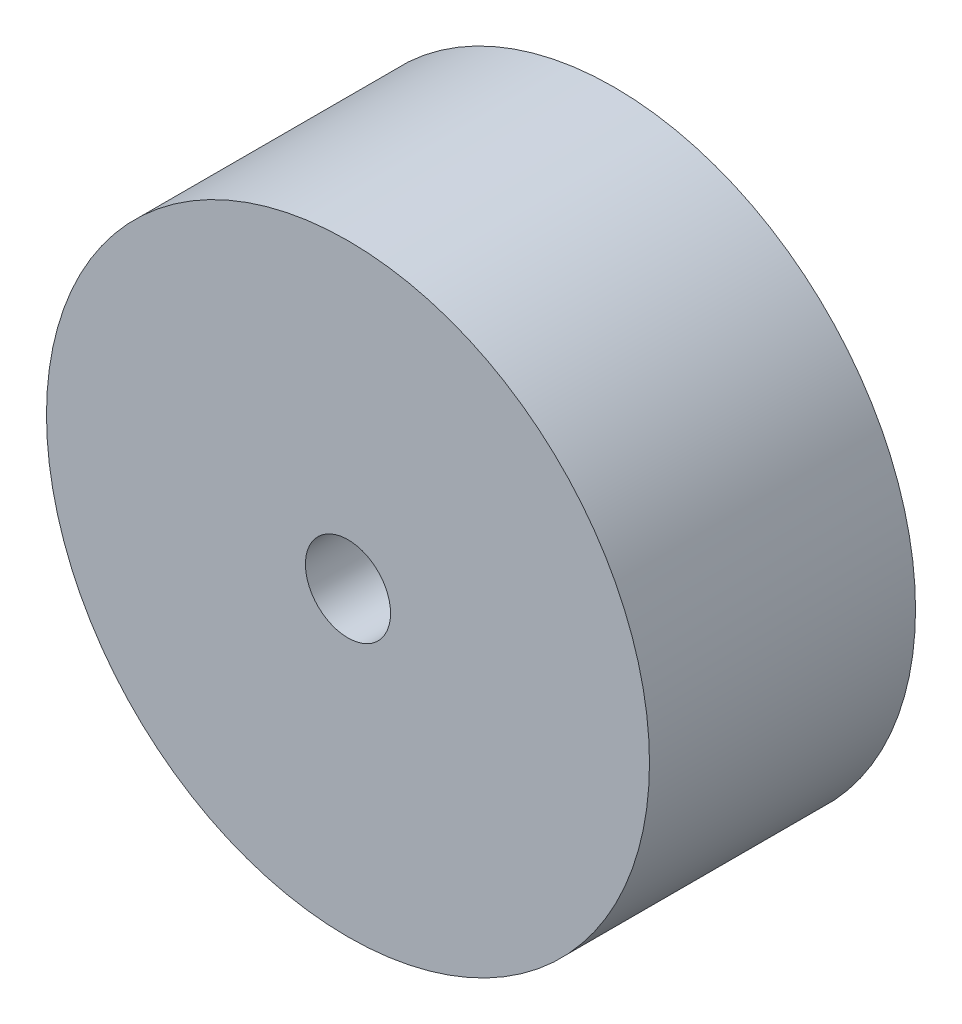
ISO-10303-21;
HEADER;
FILE_DESCRIPTION(('STEP AP214'),'2;1');
FILE_NAME('part.step','',(''),(''),'','','');
FILE_SCHEMA(('AUTOMOTIVE_DESIGN { 1 0 10303 214 1 1 1 1 }'));
ENDSEC;
DATA;
#1=APPLICATION_CONTEXT('core data for automotive mechanical design processes');
#2=APPLICATION_PROTOCOL_DEFINITION('international standard','automotive_design',2000,#1);
#3=PRODUCT_CONTEXT('',#1,'mechanical');
#4=PRODUCT('Part','Part','',(#3));
#5=PRODUCT_RELATED_PRODUCT_CATEGORY('part','',(#4));
#6=PRODUCT_DEFINITION_FORMATION('','',#4);
#7=PRODUCT_DEFINITION_CONTEXT('part definition',#1,'design');
#8=PRODUCT_DEFINITION('design','',#6,#7);
#9=PRODUCT_DEFINITION_SHAPE('','',#8);
#10=(LENGTH_UNIT() NAMED_UNIT(*) SI_UNIT(.MILLI.,.METRE.));
#11=(NAMED_UNIT(*) PLANE_ANGLE_UNIT() SI_UNIT($,.RADIAN.));
#12=(NAMED_UNIT(*) SI_UNIT($,.STERADIAN.) SOLID_ANGLE_UNIT());
#13=UNCERTAINTY_MEASURE_WITH_UNIT(LENGTH_MEASURE(1.E-05),#10,'distance_accuracy_value','');
#14=(GEOMETRIC_REPRESENTATION_CONTEXT(3) GLOBAL_UNCERTAINTY_ASSIGNED_CONTEXT((#13)) GLOBAL_UNIT_ASSIGNED_CONTEXT((#10,
#11,#12)) REPRESENTATION_CONTEXT('',''));
#15=CARTESIAN_POINT('',(0.,0.,0.));
#16=DIRECTION('',(0.,0.,1.));
#17=DIRECTION('',(1.,0.,0.));
#18=AXIS2_PLACEMENT_3D('',#15,#16,#17);
#19=CARTESIAN_POINT('',(0.,0.,19.05));
#20=DIRECTION('',(0.,0.,-1.));
#21=DIRECTION('',(-1.,0.,0.));
#22=AXIS2_PLACEMENT_3D('',#19,#20,#21);
#23=CYLINDRICAL_SURFACE('',#22,21.59);
#24=CARTESIAN_POINT('',(0.,0.,19.05));
#25=DIRECTION('',(0.,0.,1.));
#26=DIRECTION('',(1.,0.,0.));
#27=AXIS2_PLACEMENT_3D('',#24,#25,#26);
#28=CIRCLE('',#27,21.59);
#29=CARTESIAN_POINT('',(-21.59,0.,19.05));
#30=VERTEX_POINT('',#29);
#31=EDGE_CURVE('E10',#30,#30,#28,.T.);
#32=CARTESIAN_POINT('',(0.,0.,0.));
#33=DIRECTION('',(0.,0.,1.));
#34=DIRECTION('',(1.,0.,0.));
#35=AXIS2_PLACEMENT_3D('',#32,#33,#34);
#36=CIRCLE('',#35,21.59);
#37=CARTESIAN_POINT('',(-21.59,0.,0.));
#38=VERTEX_POINT('',#37);
#39=EDGE_CURVE('E34',#38,#38,#36,.T.);
#40=CARTESIAN_POINT('',(-21.59,0.,19.05));
#41=CARTESIAN_POINT('',(-21.59,0.,18.8515625));
#42=CARTESIAN_POINT('',(-21.59,0.,18.653125));
#43=CARTESIAN_POINT('',(-21.59,0.,18.25625));
#44=CARTESIAN_POINT('',(-21.59,0.,18.0578125));
#45=CARTESIAN_POINT('',(-21.59,0.,17.6609375));
#46=CARTESIAN_POINT('',(-21.59,0.,17.4625));
#47=CARTESIAN_POINT('',(-21.59,0.,17.065625));
#48=CARTESIAN_POINT('',(-21.59,0.,16.8671875));
#49=CARTESIAN_POINT('',(-21.59,0.,16.4703125));
#50=CARTESIAN_POINT('',(-21.59,0.,16.271875));
#51=CARTESIAN_POINT('',(-21.59,0.,15.875));
#52=CARTESIAN_POINT('',(-21.59,0.,15.6765625));
#53=CARTESIAN_POINT('',(-21.59,0.,15.2796875));
#54=CARTESIAN_POINT('',(-21.59,0.,15.08125));
#55=CARTESIAN_POINT('',(-21.59,0.,14.684375));
#56=CARTESIAN_POINT('',(-21.59,0.,14.4859375));
#57=CARTESIAN_POINT('',(-21.59,0.,14.0890625));
#58=CARTESIAN_POINT('',(-21.59,0.,13.890625));
#59=CARTESIAN_POINT('',(-21.59,0.,13.49375));
#60=CARTESIAN_POINT('',(-21.59,0.,13.2953125));
#61=CARTESIAN_POINT('',(-21.59,0.,12.8984375));
#62=CARTESIAN_POINT('',(-21.59,0.,12.7));
#63=CARTESIAN_POINT('',(-21.59,0.,12.303125));
#64=CARTESIAN_POINT('',(-21.59,0.,12.1046875));
#65=CARTESIAN_POINT('',(-21.59,0.,11.7078125));
#66=CARTESIAN_POINT('',(-21.59,0.,11.509375));
#67=CARTESIAN_POINT('',(-21.59,0.,11.1125));
#68=CARTESIAN_POINT('',(-21.59,0.,10.9140625));
#69=CARTESIAN_POINT('',(-21.59,0.,10.5171875));
#70=CARTESIAN_POINT('',(-21.59,0.,10.31875));
#71=CARTESIAN_POINT('',(-21.59,0.,9.921875));
#72=CARTESIAN_POINT('',(-21.59,0.,9.7234375));
#73=CARTESIAN_POINT('',(-21.59,0.,9.3265625));
#74=CARTESIAN_POINT('',(-21.59,0.,9.128125));
#75=CARTESIAN_POINT('',(-21.59,0.,8.73125));
#76=CARTESIAN_POINT('',(-21.59,0.,8.5328125));
#77=CARTESIAN_POINT('',(-21.59,0.,8.1359375));
#78=CARTESIAN_POINT('',(-21.59,0.,7.9375));
#79=CARTESIAN_POINT('',(-21.59,0.,7.540625));
#80=CARTESIAN_POINT('',(-21.59,0.,7.3421875));
#81=CARTESIAN_POINT('',(-21.59,0.,6.9453125));
#82=CARTESIAN_POINT('',(-21.59,0.,6.746875));
#83=CARTESIAN_POINT('',(-21.59,0.,6.35));
#84=CARTESIAN_POINT('',(-21.59,0.,6.1515625));
#85=CARTESIAN_POINT('',(-21.59,0.,5.7546875));
#86=CARTESIAN_POINT('',(-21.59,0.,5.55625));
#87=CARTESIAN_POINT('',(-21.59,0.,5.159375));
#88=CARTESIAN_POINT('',(-21.59,0.,4.9609375));
#89=CARTESIAN_POINT('',(-21.59,0.,4.5640625));
#90=CARTESIAN_POINT('',(-21.59,0.,4.365625));
#91=CARTESIAN_POINT('',(-21.59,0.,3.96875));
#92=CARTESIAN_POINT('',(-21.59,0.,3.7703125));
#93=CARTESIAN_POINT('',(-21.59,0.,3.3734375));
#94=CARTESIAN_POINT('',(-21.59,0.,3.175));
#95=CARTESIAN_POINT('',(-21.59,0.,2.778125));
#96=CARTESIAN_POINT('',(-21.59,0.,2.5796875));
#97=CARTESIAN_POINT('',(-21.59,0.,2.1828125));
#98=CARTESIAN_POINT('',(-21.59,0.,1.984375));
#99=CARTESIAN_POINT('',(-21.59,0.,1.5875));
#100=CARTESIAN_POINT('',(-21.59,0.,1.3890625));
#101=CARTESIAN_POINT('',(-21.59,0.,0.992187500000001));
#102=CARTESIAN_POINT('',(-21.59,0.,0.793750000000001));
#103=CARTESIAN_POINT('',(-21.59,0.,0.396875));
#104=CARTESIAN_POINT('',(-21.59,0.,0.1984375));
#105=CARTESIAN_POINT('',(-21.59,0.,0.));
#106=B_SPLINE_CURVE_WITH_KNOTS('',3,(#40,#41,#42,#43,#44,#45,#46,#47,#48,#49,#50,#51,#52,#53,
#54,#55,#56,#57,#58,#59,#60,#61,#62,#63,#64,#65,#66,#67,#68,#69,#70,#71,#72,#73,#74,#75,#76,#77,
#78,#79,#80,#81,#82,#83,#84,#85,#86,#87,#88,#89,#90,#91,#92,#93,#94,#95,#96,#97,#98,#99,#100,
#101,#102,#103,#104,#105),.UNSPECIFIED.,.F.,.F.,(4,2,2,2,2,2,2,2,2,2,2,2,2,2,2,2,2,2,2,2,2,2,2,
2,2,2,2,2,2,2,2,2,4),(0.,0.595312499999997,1.190625,1.7859375,2.38125,2.9765625,3.571875,
4.1671875,4.7625,5.3578125,5.953125,6.5484375,7.14375,7.7390625,8.334375,8.9296875,9.525,
10.1203125,10.715625,11.3109375,11.90625,12.5015625,13.096875,13.6921875,14.2875,14.8828125,
15.478125,16.0734375,16.66875,17.2640625,17.859375,18.4546875,19.05),.UNSPECIFIED.);
#107=EDGE_CURVE('BSEAM31',#30,#38,#106,.T.);
#108=ORIENTED_EDGE('',*,*,#31,.F.);
#109=ORIENTED_EDGE('',*,*,#39,.T.);
#110=ORIENTED_EDGE('',*,*,#107,.T.);
#111=ORIENTED_EDGE('',*,*,#107,.F.);
#112=EDGE_LOOP('',(#108,#110,#109,#111));
#113=FACE_BOUND('',#112,.T.);
#114=ADVANCED_FACE('F31',(#113),#23,.T.);
#115=CARTESIAN_POINT('',(0.,0.,19.05));
#116=DIRECTION('',(0.,0.,1.));
#117=DIRECTION('',(1.,0.,0.));
#118=AXIS2_PLACEMENT_3D('',#115,#116,#117);
#119=PLANE('',#118);
#120=CARTESIAN_POINT('',(0.,0.,19.05));
#121=DIRECTION('',(0.,0.,1.));
#122=DIRECTION('',(1.,0.,0.));
#123=AXIS2_PLACEMENT_3D('',#120,#121,#122);
#124=CIRCLE('',#123,3.048);
#125=CARTESIAN_POINT('',(3.048,0.,19.05));
#126=VERTEX_POINT('',#125);
#127=EDGE_CURVE('E43',#126,#126,#124,.T.);
#128=ORIENTED_EDGE('',*,*,#127,.F.);
#129=EDGE_LOOP('',(#128));
#130=FACE_BOUND('',#129,.T.);
#131=ORIENTED_EDGE('',*,*,#31,.T.);
#132=EDGE_LOOP('',(#131));
#133=FACE_BOUND('',#132,.T.);
#134=ADVANCED_FACE('F68',(#130,#133),#119,.T.);
#135=CARTESIAN_POINT('',(0.,0.,0.));
#136=DIRECTION('',(0.,0.,1.));
#137=DIRECTION('',(1.,0.,0.));
#138=AXIS2_PLACEMENT_3D('',#135,#136,#137);
#139=PLANE('',#138);
#140=CARTESIAN_POINT('',(0.,0.,0.));
#141=DIRECTION('',(0.,0.,-1.));
#142=DIRECTION('',(-1.,0.,0.));
#143=AXIS2_PLACEMENT_3D('',#140,#141,#142);
#144=CIRCLE('',#143,6.35);
#145=CARTESIAN_POINT('',(-6.35,0.,0.));
#146=VERTEX_POINT('',#145);
#147=EDGE_CURVE('E49',#146,#146,#144,.T.);
#148=ORIENTED_EDGE('',*,*,#147,.F.);
#149=EDGE_LOOP('',(#148));
#150=FACE_BOUND('',#149,.T.);
#151=ORIENTED_EDGE('',*,*,#39,.F.);
#152=EDGE_LOOP('',(#151));
#153=FACE_BOUND('',#152,.T.);
#154=ADVANCED_FACE('F64',(#150,#153),#139,.F.);
#155=CARTESIAN_POINT('',(0.,0.,11.43));
#156=DIRECTION('',(0.,0.,1.));
#157=DIRECTION('',(1.,0.,0.));
#158=AXIS2_PLACEMENT_3D('',#155,#156,#157);
#159=CYLINDRICAL_SURFACE('',#158,3.048);
#160=CARTESIAN_POINT('',(0.,0.,11.43));
#161=DIRECTION('',(0.,0.,1.));
#162=DIRECTION('',(1.,0.,0.));
#163=AXIS2_PLACEMENT_3D('',#160,#161,#162);
#164=CIRCLE('',#163,3.048);
#165=CARTESIAN_POINT('',(3.048,0.,11.43));
#166=VERTEX_POINT('',#165);
#167=EDGE_CURVE('E41',#166,#166,#164,.T.);
#168=CARTESIAN_POINT('',(3.048,0.,11.43));
#169=CARTESIAN_POINT('',(3.048,0.,11.509375));
#170=CARTESIAN_POINT('',(3.048,0.,11.58875));
#171=CARTESIAN_POINT('',(3.048,0.,11.7475));
#172=CARTESIAN_POINT('',(3.048,0.,11.826875));
#173=CARTESIAN_POINT('',(3.048,0.,11.985625));
#174=CARTESIAN_POINT('',(3.048,0.,12.065));
#175=CARTESIAN_POINT('',(3.048,0.,12.22375));
#176=CARTESIAN_POINT('',(3.048,0.,12.303125));
#177=CARTESIAN_POINT('',(3.048,0.,12.461875));
#178=CARTESIAN_POINT('',(3.048,0.,12.54125));
#179=CARTESIAN_POINT('',(3.048,0.,12.7));
#180=CARTESIAN_POINT('',(3.048,0.,12.779375));
#181=CARTESIAN_POINT('',(3.048,0.,12.938125));
#182=CARTESIAN_POINT('',(3.048,0.,13.0175));
#183=CARTESIAN_POINT('',(3.048,0.,13.17625));
#184=CARTESIAN_POINT('',(3.048,0.,13.255625));
#185=CARTESIAN_POINT('',(3.048,0.,13.414375));
#186=CARTESIAN_POINT('',(3.048,0.,13.49375));
#187=CARTESIAN_POINT('',(3.048,0.,13.6525));
#188=CARTESIAN_POINT('',(3.048,0.,13.731875));
#189=CARTESIAN_POINT('',(3.048,0.,13.890625));
#190=CARTESIAN_POINT('',(3.048,0.,13.97));
#191=CARTESIAN_POINT('',(3.048,0.,14.12875));
#192=CARTESIAN_POINT('',(3.048,0.,14.208125));
#193=CARTESIAN_POINT('',(3.048,0.,14.366875));
#194=CARTESIAN_POINT('',(3.048,0.,14.44625));
#195=CARTESIAN_POINT('',(3.048,0.,14.605));
#196=CARTESIAN_POINT('',(3.048,0.,14.684375));
#197=CARTESIAN_POINT('',(3.048,0.,14.843125));
#198=CARTESIAN_POINT('',(3.048,0.,14.9225));
#199=CARTESIAN_POINT('',(3.048,0.,15.08125));
#200=CARTESIAN_POINT('',(3.048,0.,15.160625));
#201=CARTESIAN_POINT('',(3.048,0.,15.319375));
#202=CARTESIAN_POINT('',(3.048,0.,15.39875));
#203=CARTESIAN_POINT('',(3.048,0.,15.5575));
#204=CARTESIAN_POINT('',(3.048,0.,15.636875));
#205=CARTESIAN_POINT('',(3.048,0.,15.795625));
#206=CARTESIAN_POINT('',(3.048,0.,15.875));
#207=CARTESIAN_POINT('',(3.048,0.,16.03375));
#208=CARTESIAN_POINT('',(3.048,0.,16.113125));
#209=CARTESIAN_POINT('',(3.048,0.,16.271875));
#210=CARTESIAN_POINT('',(3.048,0.,16.35125));
#211=CARTESIAN_POINT('',(3.048,0.,16.51));
#212=CARTESIAN_POINT('',(3.048,0.,16.589375));
#213=CARTESIAN_POINT('',(3.048,0.,16.748125));
#214=CARTESIAN_POINT('',(3.048,0.,16.8275));
#215=CARTESIAN_POINT('',(3.048,0.,16.98625));
#216=CARTESIAN_POINT('',(3.048,0.,17.065625));
#217=CARTESIAN_POINT('',(3.048,0.,17.224375));
#218=CARTESIAN_POINT('',(3.048,0.,17.30375));
#219=CARTESIAN_POINT('',(3.048,0.,17.4625));
#220=CARTESIAN_POINT('',(3.048,0.,17.541875));
#221=CARTESIAN_POINT('',(3.048,0.,17.700625));
#222=CARTESIAN_POINT('',(3.048,0.,17.78));
#223=CARTESIAN_POINT('',(3.048,0.,17.93875));
#224=CARTESIAN_POINT('',(3.048,0.,18.018125));
#225=CARTESIAN_POINT('',(3.048,0.,18.176875));
#226=CARTESIAN_POINT('',(3.048,0.,18.25625));
#227=CARTESIAN_POINT('',(3.048,0.,18.415));
#228=CARTESIAN_POINT('',(3.048,0.,18.494375));
#229=CARTESIAN_POINT('',(3.048,0.,18.653125));
#230=CARTESIAN_POINT('',(3.048,0.,18.7325));
#231=CARTESIAN_POINT('',(3.048,0.,18.89125));
#232=CARTESIAN_POINT('',(3.048,0.,18.970625));
#233=CARTESIAN_POINT('',(3.048,0.,19.05));
#234=B_SPLINE_CURVE_WITH_KNOTS('',3,(#168,#169,#170,#171,#172,#173,#174,#175,#176,#177,#178,
#179,#180,#181,#182,#183,#184,#185,#186,#187,#188,#189,#190,#191,#192,#193,#194,#195,#196,#197,
#198,#199,#200,#201,#202,#203,#204,#205,#206,#207,#208,#209,#210,#211,#212,#213,#214,#215,#216,
#217,#218,#219,#220,#221,#222,#223,#224,#225,#226,#227,#228,#229,#230,#231,#232,#233),
.UNSPECIFIED.,.F.,.F.,(4,2,2,2,2,2,2,2,2,2,2,2,2,2,2,2,2,2,2,2,2,2,2,2,2,2,2,2,2,2,2,2,4),(0.,
0.238124999999999,0.476249999999999,0.714375,0.952499999999998,1.190625,1.42875,1.666875,1.905,
2.143125,2.38125,2.619375,2.8575,3.095625,3.33375,3.571875,3.81,4.048125,4.28625,4.524375,
4.7625,5.000625,5.23875,5.476875,5.715,5.953125,6.19125,6.429375,6.6675,6.905625,7.14375,
7.381875,7.62),.UNSPECIFIED.);
#235=EDGE_CURVE('BSEAM67',#166,#126,#234,.T.);
#236=ORIENTED_EDGE('',*,*,#167,.F.);
#237=ORIENTED_EDGE('',*,*,#127,.T.);
#238=ORIENTED_EDGE('',*,*,#235,.T.);
#239=ORIENTED_EDGE('',*,*,#235,.F.);
#240=EDGE_LOOP('',(#236,#238,#237,#239));
#241=FACE_BOUND('',#240,.T.);
#242=ADVANCED_FACE('F67',(#241),#159,.F.);
#243=CARTESIAN_POINT('',(0.,0.,11.43));
#244=DIRECTION('',(0.,0.,1.));
#245=DIRECTION('',(1.,0.,0.));
#246=AXIS2_PLACEMENT_3D('',#243,#244,#245);
#247=PLANE('',#246);
#248=ORIENTED_EDGE('',*,*,#167,.T.);
#249=EDGE_LOOP('',(#248));
#250=FACE_BOUND('',#249,.T.);
#251=ADVANCED_FACE('F60',(#250),#247,.T.);
#252=CARTESIAN_POINT('',(0.,0.,7.62));
#253=DIRECTION('',(0.,0.,-1.));
#254=DIRECTION('',(-1.,0.,0.));
#255=AXIS2_PLACEMENT_3D('',#252,#253,#254);
#256=CYLINDRICAL_SURFACE('',#255,6.35);
#257=CARTESIAN_POINT('',(0.,0.,7.62));
#258=DIRECTION('',(0.,0.,-1.));
#259=DIRECTION('',(-1.,0.,0.));
#260=AXIS2_PLACEMENT_3D('',#257,#258,#259);
#261=CIRCLE('',#260,6.35);
#262=CARTESIAN_POINT('',(-6.35,0.,7.62));
#263=VERTEX_POINT('',#262);
#264=EDGE_CURVE('E46',#263,#263,#261,.T.);
#265=CARTESIAN_POINT('',(-6.35,0.,7.62));
#266=CARTESIAN_POINT('',(-6.35,0.,7.540625));
#267=CARTESIAN_POINT('',(-6.35,0.,7.46125));
#268=CARTESIAN_POINT('',(-6.35,0.,7.3025));
#269=CARTESIAN_POINT('',(-6.35,0.,7.223125));
#270=CARTESIAN_POINT('',(-6.35,0.,7.064375));
#271=CARTESIAN_POINT('',(-6.35,0.,6.985));
#272=CARTESIAN_POINT('',(-6.35,0.,6.82625));
#273=CARTESIAN_POINT('',(-6.35,0.,6.746875));
#274=CARTESIAN_POINT('',(-6.35,0.,6.588125));
#275=CARTESIAN_POINT('',(-6.35,0.,6.50875));
#276=CARTESIAN_POINT('',(-6.35,0.,6.35));
#277=CARTESIAN_POINT('',(-6.35,0.,6.270625));
#278=CARTESIAN_POINT('',(-6.35,0.,6.111875));
#279=CARTESIAN_POINT('',(-6.35,0.,6.0325));
#280=CARTESIAN_POINT('',(-6.35,0.,5.87375));
#281=CARTESIAN_POINT('',(-6.35,0.,5.794375));
#282=CARTESIAN_POINT('',(-6.35,0.,5.635625));
#283=CARTESIAN_POINT('',(-6.35,0.,5.55625));
#284=CARTESIAN_POINT('',(-6.35,0.,5.3975));
#285=CARTESIAN_POINT('',(-6.35,0.,5.318125));
#286=CARTESIAN_POINT('',(-6.35,0.,5.159375));
#287=CARTESIAN_POINT('',(-6.35,0.,5.08));
#288=CARTESIAN_POINT('',(-6.35,0.,4.92125));
#289=CARTESIAN_POINT('',(-6.35,0.,4.841875));
#290=CARTESIAN_POINT('',(-6.35,0.,4.683125));
#291=CARTESIAN_POINT('',(-6.35,0.,4.60375));
#292=CARTESIAN_POINT('',(-6.35,0.,4.445));
#293=CARTESIAN_POINT('',(-6.35,0.,4.365625));
#294=CARTESIAN_POINT('',(-6.35,0.,4.206875));
#295=CARTESIAN_POINT('',(-6.35,0.,4.1275));
#296=CARTESIAN_POINT('',(-6.35,0.,3.96875));
#297=CARTESIAN_POINT('',(-6.35,0.,3.889375));
#298=CARTESIAN_POINT('',(-6.35,0.,3.730625));
#299=CARTESIAN_POINT('',(-6.35,0.,3.65125));
#300=CARTESIAN_POINT('',(-6.35,0.,3.4925));
#301=CARTESIAN_POINT('',(-6.35,0.,3.413125));
#302=CARTESIAN_POINT('',(-6.35,0.,3.254375));
#303=CARTESIAN_POINT('',(-6.35,0.,3.175));
#304=CARTESIAN_POINT('',(-6.35,0.,3.01625));
#305=CARTESIAN_POINT('',(-6.35,0.,2.936875));
#306=CARTESIAN_POINT('',(-6.35,0.,2.778125));
#307=CARTESIAN_POINT('',(-6.35,0.,2.69875));
#308=CARTESIAN_POINT('',(-6.35,0.,2.54));
#309=CARTESIAN_POINT('',(-6.35,0.,2.460625));
#310=CARTESIAN_POINT('',(-6.35,0.,2.301875));
#311=CARTESIAN_POINT('',(-6.35,0.,2.2225));
#312=CARTESIAN_POINT('',(-6.35,0.,2.06375));
#313=CARTESIAN_POINT('',(-6.35,0.,1.984375));
#314=CARTESIAN_POINT('',(-6.35,0.,1.825625));
#315=CARTESIAN_POINT('',(-6.35,0.,1.74625));
#316=CARTESIAN_POINT('',(-6.35,0.,1.5875));
#317=CARTESIAN_POINT('',(-6.35,0.,1.508125));
#318=CARTESIAN_POINT('',(-6.35,0.,1.349375));
#319=CARTESIAN_POINT('',(-6.35,0.,1.27));
#320=CARTESIAN_POINT('',(-6.35,0.,1.11125));
#321=CARTESIAN_POINT('',(-6.35,0.,1.031875));
#322=CARTESIAN_POINT('',(-6.35,0.,0.873125));
#323=CARTESIAN_POINT('',(-6.35,0.,0.79375));
#324=CARTESIAN_POINT('',(-6.35,0.,0.635));
#325=CARTESIAN_POINT('',(-6.35,0.,0.555625));
#326=CARTESIAN_POINT('',(-6.35,0.,0.396875));
#327=CARTESIAN_POINT('',(-6.35,0.,0.3175));
#328=CARTESIAN_POINT('',(-6.35,0.,0.15875));
#329=CARTESIAN_POINT('',(-6.35,0.,0.0793749999999999));
#330=CARTESIAN_POINT('',(-6.35,0.,0.));
#331=B_SPLINE_CURVE_WITH_KNOTS('',3,(#265,#266,#267,#268,#269,#270,#271,#272,#273,#274,#275,
#276,#277,#278,#279,#280,#281,#282,#283,#284,#285,#286,#287,#288,#289,#290,#291,#292,#293,#294,
#295,#296,#297,#298,#299,#300,#301,#302,#303,#304,#305,#306,#307,#308,#309,#310,#311,#312,#313,
#314,#315,#316,#317,#318,#319,#320,#321,#322,#323,#324,#325,#326,#327,#328,#329,#330),
.UNSPECIFIED.,.F.,.F.,(4,2,2,2,2,2,2,2,2,2,2,2,2,2,2,2,2,2,2,2,2,2,2,2,2,2,2,2,2,2,2,2,4),(0.,
0.238125,0.476249999999999,0.714375,0.952499999999999,1.190625,1.42875,1.666875,1.905,2.143125,
2.38125,2.619375,2.8575,3.095625,3.33375,3.571875,3.81,4.048125,4.28625,4.524375,4.7625,
5.000625,5.23875,5.476875,5.715,5.953125,6.19125,6.429375,6.6675,6.905625,7.14375,7.381875,
7.62),.UNSPECIFIED.);
#332=EDGE_CURVE('BSEAM57',#263,#146,#331,.T.);
#333=ORIENTED_EDGE('',*,*,#264,.F.);
#334=ORIENTED_EDGE('',*,*,#147,.T.);
#335=ORIENTED_EDGE('',*,*,#332,.T.);
#336=ORIENTED_EDGE('',*,*,#332,.F.);
#337=EDGE_LOOP('',(#333,#335,#334,#336));
#338=FACE_BOUND('',#337,.T.);
#339=ADVANCED_FACE('F57',(#338),#256,.F.);
#340=CARTESIAN_POINT('',(0.,0.,7.62));
#341=DIRECTION('',(0.,0.,-1.));
#342=DIRECTION('',(-1.,0.,0.));
#343=AXIS2_PLACEMENT_3D('',#340,#341,#342);
#344=PLANE('',#343);
#345=ORIENTED_EDGE('',*,*,#264,.T.);
#346=EDGE_LOOP('',(#345));
#347=FACE_BOUND('',#346,.T.);
#348=ADVANCED_FACE('F55',(#347),#344,.T.);
#349=CLOSED_SHELL('',(#114,#134,#154,#242,#251,#339,#348));
#350=MANIFOLD_SOLID_BREP('B2',#349);
#351=ADVANCED_BREP_SHAPE_REPRESENTATION('',(#18,#350),#14);
#352=SHAPE_DEFINITION_REPRESENTATION(#9,#351);
ENDSEC;
END-ISO-10303-21;
